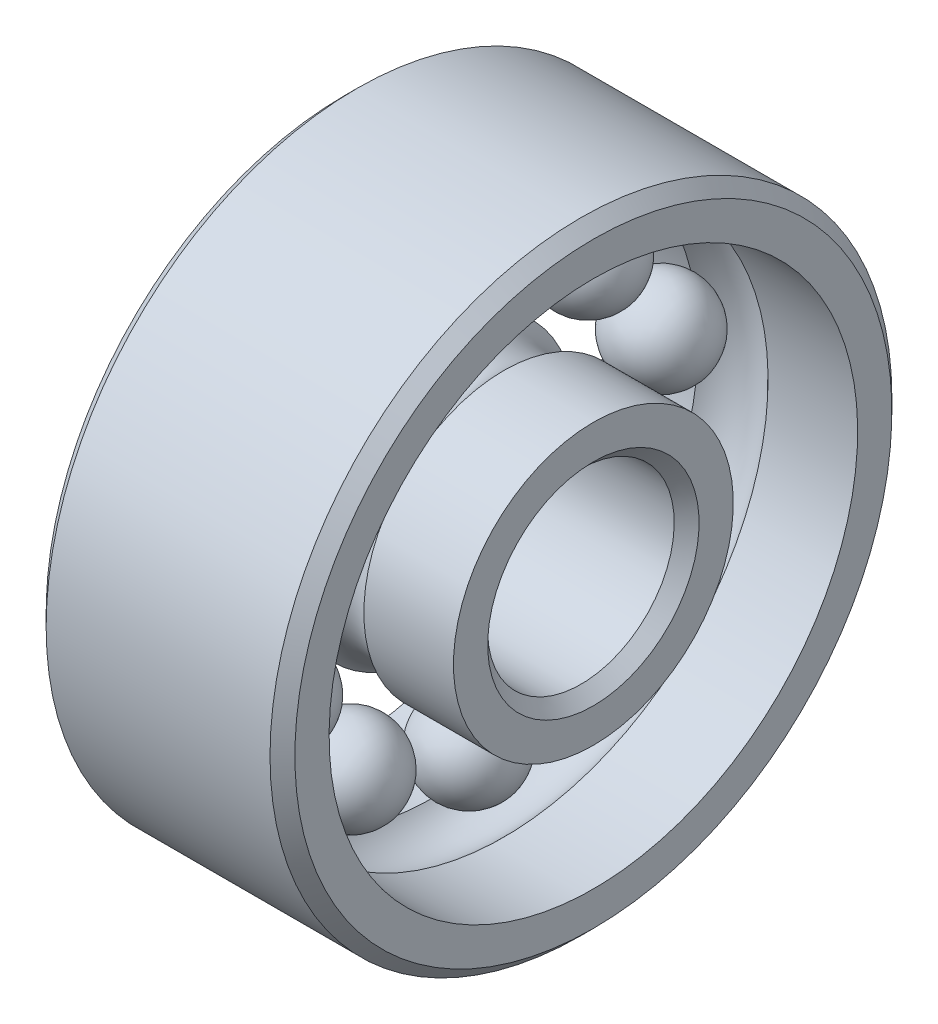
ISO-10303-21;
HEADER;
FILE_DESCRIPTION(('STEP AP214'),'2;1');
FILE_NAME('part.step','',(''),(''),'','','');
FILE_SCHEMA(('AUTOMOTIVE_DESIGN { 1 0 10303 214 1 1 1 1 }'));
ENDSEC;
DATA;
#1=APPLICATION_CONTEXT('core data for automotive mechanical design processes');
#2=APPLICATION_PROTOCOL_DEFINITION('international standard','automotive_design',2000,#1);
#3=PRODUCT_CONTEXT('',#1,'mechanical');
#4=PRODUCT('Part','Part','',(#3));
#5=PRODUCT_RELATED_PRODUCT_CATEGORY('part','',(#4));
#6=PRODUCT_DEFINITION_FORMATION('','',#4);
#7=PRODUCT_DEFINITION_CONTEXT('part definition',#1,'design');
#8=PRODUCT_DEFINITION('design','',#6,#7);
#9=PRODUCT_DEFINITION_SHAPE('','',#8);
#10=(LENGTH_UNIT() NAMED_UNIT(*) SI_UNIT(.MILLI.,.METRE.));
#11=(NAMED_UNIT(*) PLANE_ANGLE_UNIT() SI_UNIT($,.RADIAN.));
#12=(NAMED_UNIT(*) SI_UNIT($,.STERADIAN.) SOLID_ANGLE_UNIT());
#13=UNCERTAINTY_MEASURE_WITH_UNIT(LENGTH_MEASURE(1.E-05),#10,'distance_accuracy_value','');
#14=(GEOMETRIC_REPRESENTATION_CONTEXT(3) GLOBAL_UNCERTAINTY_ASSIGNED_CONTEXT((#13)) GLOBAL_UNIT_ASSIGNED_CONTEXT((#10,
#11,#12)) REPRESENTATION_CONTEXT('',''));
#15=CARTESIAN_POINT('',(0.,0.,0.));
#16=DIRECTION('',(0.,0.,1.));
#17=DIRECTION('',(1.,0.,0.));
#18=AXIS2_PLACEMENT_3D('',#15,#16,#17);
#19=CARTESIAN_POINT('',(0.,2.6293052317186,-1.9103020699505));
#20=DIRECTION('',(-1.,0.,0.));
#21=DIRECTION('',(0.,0.809016994374955,-0.587785252292462));
#22=AXIS2_PLACEMENT_3D('',#19,#20,#21);
#23=SPHERICAL_SURFACE('',#22,0.75);
#24=CARTESIAN_POINT('',(-0.75,2.6293052317186,-1.9103020699505));
#25=VERTEX_POINT('',#24);
#26=VERTEX_LOOP('',#25);
#27=FACE_BOUND('',#26,.T.);
#28=ADVANCED_FACE('F38',(#27),#23,.T.);
#29=CLOSED_SHELL('',(#28));
#30=MANIFOLD_SOLID_BREP('B2',#29);
#31=CARTESIAN_POINT('',(0.,1.00430523171861,-3.09093367795924));
#32=DIRECTION('',(-1.,0.,0.));
#33=DIRECTION('',(0.,0.309016994374958,-0.95105651629515));
#34=AXIS2_PLACEMENT_3D('',#31,#32,#33);
#35=SPHERICAL_SURFACE('',#34,0.75);
#36=CARTESIAN_POINT('',(-0.75,1.00430523171861,-3.09093367795924));
#37=VERTEX_POINT('',#36);
#38=VERTEX_LOOP('',#37);
#39=FACE_BOUND('',#38,.T.);
#40=ADVANCED_FACE('F57',(#39),#35,.T.);
#41=CLOSED_SHELL('',(#40));
#42=MANIFOLD_SOLID_BREP('B6',#41);
#43=CARTESIAN_POINT('',(0.,-1.00430523171855,-3.09093367795926));
#44=DIRECTION('',(-1.,0.,0.));
#45=DIRECTION('',(0.,-0.309016994374938,-0.951056516295157));
#46=AXIS2_PLACEMENT_3D('',#43,#44,#45);
#47=SPHERICAL_SURFACE('',#46,0.75);
#48=CARTESIAN_POINT('',(-0.749999999999999,-1.00430523171855,-3.09093367795926));
#49=VERTEX_POINT('',#48);
#50=VERTEX_LOOP('',#49);
#51=FACE_BOUND('',#50,.T.);
#52=ADVANCED_FACE('F76',(#51),#47,.T.);
#53=CLOSED_SHELL('',(#52));
#54=MANIFOLD_SOLID_BREP('B34',#53);
#55=CARTESIAN_POINT('',(0.,-2.62930523171856,-1.91030206995056));
#56=DIRECTION('',(-1.,0.,0.));
#57=DIRECTION('',(0.,-0.809016994374942,-0.58778525229248));
#58=AXIS2_PLACEMENT_3D('',#55,#56,#57);
#59=SPHERICAL_SURFACE('',#58,0.75);
#60=CARTESIAN_POINT('',(-0.749999999999999,-2.62930523171856,-1.91030206995056));
#61=VERTEX_POINT('',#60);
#62=VERTEX_LOOP('',#61);
#63=FACE_BOUND('',#62,.T.);
#64=ADVANCED_FACE('F95',(#63),#59,.T.);
#65=CLOSED_SHELL('',(#64));
#66=MANIFOLD_SOLID_BREP('B53',#65);
#67=CARTESIAN_POINT('',(0.,-3.25,0.));
#68=DIRECTION('',(-1.,0.,0.));
#69=DIRECTION('',(0.,-1.,0.));
#70=AXIS2_PLACEMENT_3D('',#67,#68,#69);
#71=SPHERICAL_SURFACE('',#70,0.75);
#72=CARTESIAN_POINT('',(-0.749999999999999,-3.25,0.));
#73=VERTEX_POINT('',#72);
#74=VERTEX_LOOP('',#73);
#75=FACE_BOUND('',#74,.T.);
#76=ADVANCED_FACE('F114',(#75),#71,.T.);
#77=CLOSED_SHELL('',(#76));
#78=MANIFOLD_SOLID_BREP('B72',#77);
#79=CARTESIAN_POINT('',(0.,-2.62930523171859,1.91030206995052));
#80=DIRECTION('',(-1.,0.,0.));
#81=DIRECTION('',(0.,-0.809016994374951,0.587785252292469));
#82=AXIS2_PLACEMENT_3D('',#79,#80,#81);
#83=SPHERICAL_SURFACE('',#82,0.75);
#84=CARTESIAN_POINT('',(-0.749999999999999,-2.62930523171859,1.91030206995052));
#85=VERTEX_POINT('',#84);
#86=VERTEX_LOOP('',#85);
#87=FACE_BOUND('',#86,.T.);
#88=ADVANCED_FACE('F133',(#87),#83,.T.);
#89=CLOSED_SHELL('',(#88));
#90=MANIFOLD_SOLID_BREP('B91',#89);
#91=CARTESIAN_POINT('',(0.,-1.00430523171859,3.09093367795925));
#92=DIRECTION('',(-1.,0.,0.));
#93=DIRECTION('',(0.,-0.309016994374952,0.951056516295152));
#94=AXIS2_PLACEMENT_3D('',#91,#92,#93);
#95=SPHERICAL_SURFACE('',#94,0.75);
#96=CARTESIAN_POINT('',(-0.749999999999999,-1.00430523171859,3.09093367795925));
#97=VERTEX_POINT('',#96);
#98=VERTEX_LOOP('',#97);
#99=FACE_BOUND('',#98,.T.);
#100=ADVANCED_FACE('F152',(#99),#95,.T.);
#101=CLOSED_SHELL('',(#100));
#102=MANIFOLD_SOLID_BREP('B110',#101);
#103=CARTESIAN_POINT('',(0.,1.00430523171857,3.09093367795925));
#104=DIRECTION('',(-1.,0.,0.));
#105=DIRECTION('',(0.,0.309016994374945,0.951056516295155));
#106=AXIS2_PLACEMENT_3D('',#103,#104,#105);
#107=SPHERICAL_SURFACE('',#106,0.75);
#108=CARTESIAN_POINT('',(-0.75,1.00430523171857,3.09093367795925));
#109=VERTEX_POINT('',#108);
#110=VERTEX_LOOP('',#109);
#111=FACE_BOUND('',#110,.T.);
#112=ADVANCED_FACE('F171',(#111),#107,.T.);
#113=CLOSED_SHELL('',(#112));
#114=MANIFOLD_SOLID_BREP('B129',#113);
#115=CARTESIAN_POINT('',(0.,2.62930523171858,1.91030206995054));
#116=DIRECTION('',(-1.,0.,0.));
#117=DIRECTION('',(0.,0.809016994374947,0.587785252292474));
#118=AXIS2_PLACEMENT_3D('',#115,#116,#117);
#119=SPHERICAL_SURFACE('',#118,0.75);
#120=CARTESIAN_POINT('',(-0.75,2.62930523171858,1.91030206995054));
#121=VERTEX_POINT('',#120);
#122=VERTEX_LOOP('',#121);
#123=FACE_BOUND('',#122,.T.);
#124=ADVANCED_FACE('F190',(#123),#119,.T.);
#125=CLOSED_SHELL('',(#124));
#126=MANIFOLD_SOLID_BREP('B148',#125);
#127=CARTESIAN_POINT('',(0.,3.25,0.));
#128=DIRECTION('',(-1.,0.,0.));
#129=DIRECTION('',(0.,1.,0.));
#130=AXIS2_PLACEMENT_3D('',#127,#128,#129);
#131=SPHERICAL_SURFACE('',#130,0.75);
#132=CARTESIAN_POINT('',(-0.75,3.25,0.));
#133=VERTEX_POINT('',#132);
#134=VERTEX_LOOP('',#133);
#135=FACE_BOUND('',#134,.T.);
#136=ADVANCED_FACE('F211',(#135),#131,.T.);
#137=CLOSED_SHELL('',(#136));
#138=MANIFOLD_SOLID_BREP('B167',#137);
#139=CARTESIAN_POINT('',(2.,5.,0.));
#140=DIRECTION('',(1.,0.,0.));
#141=DIRECTION('',(0.,1.,0.));
#142=AXIS2_PLACEMENT_3D('',#139,#140,#141);
#143=PLANE('',#142);
#144=CARTESIAN_POINT('',(2.,0.,0.));
#145=DIRECTION('',(1.,0.,0.));
#146=DIRECTION('',(0.,1.,0.));
#147=AXIS2_PLACEMENT_3D('',#144,#145,#146);
#148=CIRCLE('',#147,4.80000000000001);
#149=CARTESIAN_POINT('',(2.,4.80000000000001,0.));
#150=VERTEX_POINT('',#149);
#151=EDGE_CURVE('E210',#150,#150,#148,.T.);
#152=ORIENTED_EDGE('',*,*,#151,.T.);
#153=EDGE_LOOP('',(#152));
#154=FACE_BOUND('',#153,.T.);
#155=CARTESIAN_POINT('',(2.,0.,0.));
#156=DIRECTION('',(1.,0.,0.));
#157=DIRECTION('',(0.,1.,0.));
#158=AXIS2_PLACEMENT_3D('',#155,#156,#157);
#159=CIRCLE('',#158,4.25);
#160=CARTESIAN_POINT('',(2.,4.25,0.));
#161=VERTEX_POINT('',#160);
#162=EDGE_CURVE('E252',#161,#161,#159,.T.);
#163=ORIENTED_EDGE('',*,*,#162,.F.);
#164=EDGE_LOOP('',(#163));
#165=FACE_BOUND('',#164,.T.);
#166=ADVANCED_FACE('F231',(#154,#165),#143,.T.);
#167=CARTESIAN_POINT('',(1.05892746709144,0.,0.));
#168=DIRECTION('',(1.,0.,0.));
#169=DIRECTION('',(0.,1.,0.));
#170=AXIS2_PLACEMENT_3D('',#167,#168,#169);
#171=CYLINDRICAL_SURFACE('',#170,4.25);
#172=ORIENTED_EDGE('',*,*,#162,.T.);
#173=EDGE_LOOP('',(#172));
#174=FACE_BOUND('',#173,.T.);
#175=CARTESIAN_POINT('',(0.559016994374949,0.,0.));
#176=DIRECTION('',(1.,0.,0.));
#177=DIRECTION('',(0.,1.,0.));
#178=AXIS2_PLACEMENT_3D('',#175,#176,#177);
#179=CIRCLE('',#178,4.25);
#180=CARTESIAN_POINT('',(0.559016994374948,4.25,0.));
#181=VERTEX_POINT('',#180);
#182=EDGE_CURVE('E255',#181,#181,#179,.T.);
#183=ORIENTED_EDGE('',*,*,#182,.F.);
#184=EDGE_LOOP('',(#183));
#185=FACE_BOUND('',#184,.T.);
#186=ADVANCED_FACE('F278',(#174,#185),#171,.F.);
#187=CARTESIAN_POINT('',(0.,0.,0.));
#188=DIRECTION('',(1.,0.,0.));
#189=DIRECTION('',(0.,1.,0.));
#190=AXIS2_PLACEMENT_3D('',#187,#188,#189);
#191=TOROIDAL_SURFACE('',#190,3.75,0.75);
#192=ORIENTED_EDGE('',*,*,#182,.T.);
#193=EDGE_LOOP('',(#192));
#194=FACE_BOUND('',#193,.T.);
#195=CARTESIAN_POINT('',(-0.559016994374948,0.,0.));
#196=DIRECTION('',(1.,0.,0.));
#197=DIRECTION('',(0.,1.,0.));
#198=AXIS2_PLACEMENT_3D('',#195,#196,#197);
#199=CIRCLE('',#198,4.25);
#200=CARTESIAN_POINT('',(-0.559016994374948,4.25,0.));
#201=VERTEX_POINT('',#200);
#202=EDGE_CURVE('E258',#201,#201,#199,.T.);
#203=ORIENTED_EDGE('',*,*,#202,.F.);
#204=EDGE_LOOP('',(#203));
#205=FACE_BOUND('',#204,.T.);
#206=ADVANCED_FACE('F269',(#194,#205),#191,.F.);
#207=CARTESIAN_POINT('',(1.05892746709144,0.,0.));
#208=DIRECTION('',(1.,0.,0.));
#209=DIRECTION('',(0.,1.,0.));
#210=AXIS2_PLACEMENT_3D('',#207,#208,#209);
#211=CYLINDRICAL_SURFACE('',#210,4.25);
#212=ORIENTED_EDGE('',*,*,#202,.T.);
#213=EDGE_LOOP('',(#212));
#214=FACE_BOUND('',#213,.T.);
#215=CARTESIAN_POINT('',(-2.,0.,0.));
#216=DIRECTION('',(1.,0.,0.));
#217=DIRECTION('',(0.,1.,0.));
#218=AXIS2_PLACEMENT_3D('',#215,#216,#217);
#219=CIRCLE('',#218,4.25);
#220=CARTESIAN_POINT('',(-2.,4.25,0.));
#221=VERTEX_POINT('',#220);
#222=EDGE_CURVE('E261',#221,#221,#219,.T.);
#223=ORIENTED_EDGE('',*,*,#222,.F.);
#224=EDGE_LOOP('',(#223));
#225=FACE_BOUND('',#224,.T.);
#226=ADVANCED_FACE('F267',(#214,#225),#211,.F.);
#227=CARTESIAN_POINT('',(-2.,4.25,0.));
#228=DIRECTION('',(-1.,0.,0.));
#229=DIRECTION('',(0.,-1.,0.));
#230=AXIS2_PLACEMENT_3D('',#227,#228,#229);
#231=PLANE('',#230);
#232=CARTESIAN_POINT('',(-2.,0.,0.));
#233=DIRECTION('',(-1.,0.,0.));
#234=DIRECTION('',(0.,-1.,0.));
#235=AXIS2_PLACEMENT_3D('',#232,#233,#234);
#236=CIRCLE('',#235,4.8);
#237=CARTESIAN_POINT('',(-2.,-4.8,0.));
#238=VERTEX_POINT('',#237);
#239=EDGE_CURVE('E239',#238,#238,#236,.T.);
#240=ORIENTED_EDGE('',*,*,#239,.T.);
#241=EDGE_LOOP('',(#240));
#242=FACE_BOUND('',#241,.T.);
#243=ORIENTED_EDGE('',*,*,#222,.T.);
#244=EDGE_LOOP('',(#243));
#245=FACE_BOUND('',#244,.T.);
#246=ADVANCED_FACE('F265',(#242,#245),#231,.T.);
#247=CARTESIAN_POINT('',(1.05892746709144,0.,0.));
#248=DIRECTION('',(1.,0.,0.));
#249=DIRECTION('',(0.,1.,0.));
#250=AXIS2_PLACEMENT_3D('',#247,#248,#249);
#251=CYLINDRICAL_SURFACE('',#250,5.);
#252=CARTESIAN_POINT('',(-1.8,0.,0.));
#253=DIRECTION('',(-1.,0.,0.));
#254=DIRECTION('',(0.,-1.,0.));
#255=AXIS2_PLACEMENT_3D('',#252,#253,#254);
#256=CIRCLE('',#255,5.);
#257=CARTESIAN_POINT('',(-1.8,-5.,0.));
#258=VERTEX_POINT('',#257);
#259=EDGE_CURVE('E243',#258,#258,#256,.F.);
#260=ORIENTED_EDGE('',*,*,#259,.T.);
#261=EDGE_LOOP('',(#260));
#262=FACE_BOUND('',#261,.T.);
#263=CARTESIAN_POINT('',(1.8,0.,0.));
#264=DIRECTION('',(1.,0.,0.));
#265=DIRECTION('',(0.,1.,0.));
#266=AXIS2_PLACEMENT_3D('',#263,#264,#265);
#267=CIRCLE('',#266,5.);
#268=CARTESIAN_POINT('',(1.8,5.,0.));
#269=VERTEX_POINT('',#268);
#270=EDGE_CURVE('E247',#269,#269,#267,.F.);
#271=ORIENTED_EDGE('',*,*,#270,.T.);
#272=EDGE_LOOP('',(#271));
#273=FACE_BOUND('',#272,.T.);
#274=ADVANCED_FACE('F276',(#262,#273),#251,.T.);
#275=CARTESIAN_POINT('',(-1.8,0.,0.));
#276=DIRECTION('',(1.,0.,0.));
#277=DIRECTION('',(0.,1.,0.));
#278=AXIS2_PLACEMENT_3D('',#275,#276,#277);
#279=CONICAL_SURFACE('',#278,5.,0.78539816339745);
#280=ORIENTED_EDGE('',*,*,#239,.F.);
#281=EDGE_LOOP('',(#280));
#282=FACE_BOUND('',#281,.T.);
#283=ORIENTED_EDGE('',*,*,#259,.F.);
#284=EDGE_LOOP('',(#283));
#285=FACE_BOUND('',#284,.T.);
#286=ADVANCED_FACE('F290',(#282,#285),#279,.T.);
#287=CARTESIAN_POINT('',(2.,0.,0.));
#288=DIRECTION('',(-1.,0.,0.));
#289=DIRECTION('',(0.,-1.,0.));
#290=AXIS2_PLACEMENT_3D('',#287,#288,#289);
#291=CONICAL_SURFACE('',#290,4.80000000000001,0.785398163397441);
#292=ORIENTED_EDGE('',*,*,#270,.F.);
#293=EDGE_LOOP('',(#292));
#294=FACE_BOUND('',#293,.T.);
#295=ORIENTED_EDGE('',*,*,#151,.F.);
#296=EDGE_LOOP('',(#295));
#297=FACE_BOUND('',#296,.T.);
#298=ADVANCED_FACE('F234',(#294,#297),#291,.T.);
#299=CLOSED_SHELL('',(#166,#186,#206,#226,#246,#274,#286,#298));
#300=MANIFOLD_SOLID_BREP('B186',#299);
#301=CARTESIAN_POINT('',(1.05892746709144,0.,0.));
#302=DIRECTION('',(1.,0.,0.));
#303=DIRECTION('',(0.,1.,0.));
#304=AXIS2_PLACEMENT_3D('',#301,#302,#303);
#305=CYLINDRICAL_SURFACE('',#304,2.25);
#306=CARTESIAN_POINT('',(0.559016994374947,0.,0.));
#307=DIRECTION('',(1.,0.,0.));
#308=DIRECTION('',(0.,1.,0.));
#309=AXIS2_PLACEMENT_3D('',#306,#307,#308);
#310=CIRCLE('',#309,2.25);
#311=CARTESIAN_POINT('',(0.559016994374947,2.25,0.));
#312=VERTEX_POINT('',#311);
#313=EDGE_CURVE('E380',#312,#312,#310,.T.);
#314=ORIENTED_EDGE('',*,*,#313,.T.);
#315=EDGE_LOOP('',(#314));
#316=FACE_BOUND('',#315,.T.);
#317=CARTESIAN_POINT('',(2.,0.,0.));
#318=DIRECTION('',(1.,0.,0.));
#319=DIRECTION('',(0.,1.,0.));
#320=AXIS2_PLACEMENT_3D('',#317,#318,#319);
#321=CIRCLE('',#320,2.25);
#322=CARTESIAN_POINT('',(2.,2.25,0.));
#323=VERTEX_POINT('',#322);
#324=EDGE_CURVE('E389',#323,#323,#321,.T.);
#325=ORIENTED_EDGE('',*,*,#324,.F.);
#326=EDGE_LOOP('',(#325));
#327=FACE_BOUND('',#326,.T.);
#328=ADVANCED_FACE('F359',(#316,#327),#305,.T.);
#329=CARTESIAN_POINT('',(0.,0.,0.));
#330=DIRECTION('',(1.,0.,0.));
#331=DIRECTION('',(0.,1.,0.));
#332=AXIS2_PLACEMENT_3D('',#329,#330,#331);
#333=TOROIDAL_SURFACE('',#332,2.75,0.75);
#334=CARTESIAN_POINT('',(-0.559016994374947,0.,0.));
#335=DIRECTION('',(1.,0.,0.));
#336=DIRECTION('',(0.,1.,0.));
#337=AXIS2_PLACEMENT_3D('',#334,#335,#336);
#338=CIRCLE('',#337,2.25);
#339=CARTESIAN_POINT('',(-0.559016994374948,2.25,0.));
#340=VERTEX_POINT('',#339);
#341=EDGE_CURVE('E383',#340,#340,#338,.T.);
#342=ORIENTED_EDGE('',*,*,#341,.T.);
#343=EDGE_LOOP('',(#342));
#344=FACE_BOUND('',#343,.T.);
#345=ORIENTED_EDGE('',*,*,#313,.F.);
#346=EDGE_LOOP('',(#345));
#347=FACE_BOUND('',#346,.T.);
#348=ADVANCED_FACE('F396',(#344,#347),#333,.F.);
#349=CARTESIAN_POINT('',(1.05892746709144,0.,0.));
#350=DIRECTION('',(1.,0.,0.));
#351=DIRECTION('',(0.,1.,0.));
#352=AXIS2_PLACEMENT_3D('',#349,#350,#351);
#353=CYLINDRICAL_SURFACE('',#352,2.25);
#354=CARTESIAN_POINT('',(-2.,0.,0.));
#355=DIRECTION('',(1.,0.,0.));
#356=DIRECTION('',(0.,1.,0.));
#357=AXIS2_PLACEMENT_3D('',#354,#355,#356);
#358=CIRCLE('',#357,2.25);
#359=CARTESIAN_POINT('',(-2.,2.25,0.));
#360=VERTEX_POINT('',#359);
#361=EDGE_CURVE('E386',#360,#360,#358,.T.);
#362=ORIENTED_EDGE('',*,*,#361,.T.);
#363=EDGE_LOOP('',(#362));
#364=FACE_BOUND('',#363,.T.);
#365=ORIENTED_EDGE('',*,*,#341,.F.);
#366=EDGE_LOOP('',(#365));
#367=FACE_BOUND('',#366,.T.);
#368=ADVANCED_FACE('F402',(#364,#367),#353,.T.);
#369=CARTESIAN_POINT('',(-2.,1.5,0.));
#370=DIRECTION('',(-1.,0.,0.));
#371=DIRECTION('',(0.,-1.,0.));
#372=AXIS2_PLACEMENT_3D('',#369,#370,#371);
#373=PLANE('',#372);
#374=CARTESIAN_POINT('',(-2.,0.,0.));
#375=DIRECTION('',(-1.,0.,0.));
#376=DIRECTION('',(0.,-1.,0.));
#377=AXIS2_PLACEMENT_3D('',#374,#375,#376);
#378=CIRCLE('',#377,1.7);
#379=CARTESIAN_POINT('',(-2.,-1.7,0.));
#380=VERTEX_POINT('',#379);
#381=EDGE_CURVE('E230',#380,#380,#378,.F.);
#382=ORIENTED_EDGE('',*,*,#381,.T.);
#383=EDGE_LOOP('',(#382));
#384=FACE_BOUND('',#383,.T.);
#385=ORIENTED_EDGE('',*,*,#361,.F.);
#386=EDGE_LOOP('',(#385));
#387=FACE_BOUND('',#386,.T.);
#388=ADVANCED_FACE('F424',(#384,#387),#373,.T.);
#389=CARTESIAN_POINT('',(1.05892746709144,0.,0.));
#390=DIRECTION('',(1.,0.,0.));
#391=DIRECTION('',(0.,1.,0.));
#392=AXIS2_PLACEMENT_3D('',#389,#390,#391);
#393=CYLINDRICAL_SURFACE('',#392,1.5);
#394=CARTESIAN_POINT('',(1.8,0.,0.));
#395=DIRECTION('',(1.,0.,0.));
#396=DIRECTION('',(0.,1.,0.));
#397=AXIS2_PLACEMENT_3D('',#394,#395,#396);
#398=CIRCLE('',#397,1.5);
#399=CARTESIAN_POINT('',(1.8,1.5,0.));
#400=VERTEX_POINT('',#399);
#401=EDGE_CURVE('E371',#400,#400,#398,.T.);
#402=ORIENTED_EDGE('',*,*,#401,.T.);
#403=EDGE_LOOP('',(#402));
#404=FACE_BOUND('',#403,.T.);
#405=CARTESIAN_POINT('',(-1.8,0.,0.));
#406=DIRECTION('',(-1.,0.,0.));
#407=DIRECTION('',(0.,-1.,0.));
#408=AXIS2_PLACEMENT_3D('',#405,#406,#407);
#409=CIRCLE('',#408,1.5);
#410=CARTESIAN_POINT('',(-1.8,-1.5,0.));
#411=VERTEX_POINT('',#410);
#412=EDGE_CURVE('E375',#411,#411,#409,.T.);
#413=ORIENTED_EDGE('',*,*,#412,.T.);
#414=EDGE_LOOP('',(#413));
#415=FACE_BOUND('',#414,.T.);
#416=ADVANCED_FACE('F417',(#404,#415),#393,.F.);
#417=CARTESIAN_POINT('',(2.,1.5,0.));
#418=DIRECTION('',(1.,0.,0.));
#419=DIRECTION('',(0.,1.,0.));
#420=AXIS2_PLACEMENT_3D('',#417,#418,#419);
#421=PLANE('',#420);
#422=CARTESIAN_POINT('',(2.,0.,0.));
#423=DIRECTION('',(1.,0.,0.));
#424=DIRECTION('',(0.,1.,0.));
#425=AXIS2_PLACEMENT_3D('',#422,#423,#424);
#426=CIRCLE('',#425,1.7);
#427=CARTESIAN_POINT('',(2.,1.7,0.));
#428=VERTEX_POINT('',#427);
#429=EDGE_CURVE('E367',#428,#428,#426,.F.);
#430=ORIENTED_EDGE('',*,*,#429,.T.);
#431=EDGE_LOOP('',(#430));
#432=FACE_BOUND('',#431,.T.);
#433=ORIENTED_EDGE('',*,*,#324,.T.);
#434=EDGE_LOOP('',(#433));
#435=FACE_BOUND('',#434,.T.);
#436=ADVANCED_FACE('F393',(#432,#435),#421,.T.);
#437=CARTESIAN_POINT('',(1.8,0.,0.));
#438=DIRECTION('',(1.,0.,0.));
#439=DIRECTION('',(0.,1.,0.));
#440=AXIS2_PLACEMENT_3D('',#437,#438,#439);
#441=CONICAL_SURFACE('',#440,1.5,0.785398163397451);
#442=ORIENTED_EDGE('',*,*,#429,.F.);
#443=EDGE_LOOP('',(#442));
#444=FACE_BOUND('',#443,.T.);
#445=ORIENTED_EDGE('',*,*,#401,.F.);
#446=EDGE_LOOP('',(#445));
#447=FACE_BOUND('',#446,.T.);
#448=ADVANCED_FACE('F407',(#444,#447),#441,.F.);
#449=CARTESIAN_POINT('',(-2.,0.,0.));
#450=DIRECTION('',(-1.,0.,0.));
#451=DIRECTION('',(0.,-1.,0.));
#452=AXIS2_PLACEMENT_3D('',#449,#450,#451);
#453=CONICAL_SURFACE('',#452,1.7,0.785398163397447);
#454=CARTESIAN_POINT('',(-1.8,-1.5,0.));
#455=CARTESIAN_POINT('',(-1.80208333333333,-1.50208333333333,0.));
#456=CARTESIAN_POINT('',(-1.80416666666667,-1.50416666666667,0.));
#457=CARTESIAN_POINT('',(-1.80833333333333,-1.50833333333333,0.));
#458=CARTESIAN_POINT('',(-1.81041666666667,-1.51041666666667,0.));
#459=CARTESIAN_POINT('',(-1.81458333333333,-1.51458333333333,0.));
#460=CARTESIAN_POINT('',(-1.81666666666667,-1.51666666666667,0.));
#461=CARTESIAN_POINT('',(-1.82083333333333,-1.52083333333333,0.));
#462=CARTESIAN_POINT('',(-1.82291666666667,-1.52291666666667,0.));
#463=CARTESIAN_POINT('',(-1.82708333333333,-1.52708333333333,0.));
#464=CARTESIAN_POINT('',(-1.82916666666667,-1.52916666666667,0.));
#465=CARTESIAN_POINT('',(-1.83333333333333,-1.53333333333333,0.));
#466=CARTESIAN_POINT('',(-1.83541666666667,-1.53541666666667,0.));
#467=CARTESIAN_POINT('',(-1.83958333333333,-1.53958333333333,0.));
#468=CARTESIAN_POINT('',(-1.84166666666667,-1.54166666666667,0.));
#469=CARTESIAN_POINT('',(-1.84583333333333,-1.54583333333333,0.));
#470=CARTESIAN_POINT('',(-1.84791666666667,-1.54791666666667,0.));
#471=CARTESIAN_POINT('',(-1.85208333333333,-1.55208333333333,0.));
#472=CARTESIAN_POINT('',(-1.85416666666667,-1.55416666666667,0.));
#473=CARTESIAN_POINT('',(-1.85833333333333,-1.55833333333333,0.));
#474=CARTESIAN_POINT('',(-1.86041666666667,-1.56041666666667,0.));
#475=CARTESIAN_POINT('',(-1.86458333333333,-1.56458333333333,0.));
#476=CARTESIAN_POINT('',(-1.86666666666667,-1.56666666666667,0.));
#477=CARTESIAN_POINT('',(-1.87083333333333,-1.57083333333333,0.));
#478=CARTESIAN_POINT('',(-1.87291666666667,-1.57291666666667,0.));
#479=CARTESIAN_POINT('',(-1.87708333333333,-1.57708333333333,0.));
#480=CARTESIAN_POINT('',(-1.87916666666667,-1.57916666666667,0.));
#481=CARTESIAN_POINT('',(-1.88333333333333,-1.58333333333333,0.));
#482=CARTESIAN_POINT('',(-1.88541666666667,-1.58541666666667,0.));
#483=CARTESIAN_POINT('',(-1.88958333333333,-1.58958333333333,0.));
#484=CARTESIAN_POINT('',(-1.89166666666667,-1.59166666666667,0.));
#485=CARTESIAN_POINT('',(-1.89583333333333,-1.59583333333333,0.));
#486=CARTESIAN_POINT('',(-1.89791666666667,-1.59791666666667,0.));
#487=CARTESIAN_POINT('',(-1.90208333333333,-1.60208333333333,0.));
#488=CARTESIAN_POINT('',(-1.90416666666667,-1.60416666666667,0.));
#489=CARTESIAN_POINT('',(-1.90833333333333,-1.60833333333333,0.));
#490=CARTESIAN_POINT('',(-1.91041666666667,-1.61041666666667,0.));
#491=CARTESIAN_POINT('',(-1.91458333333333,-1.61458333333333,0.));
#492=CARTESIAN_POINT('',(-1.91666666666667,-1.61666666666667,0.));
#493=CARTESIAN_POINT('',(-1.92083333333333,-1.62083333333333,0.));
#494=CARTESIAN_POINT('',(-1.92291666666667,-1.62291666666667,0.));
#495=CARTESIAN_POINT('',(-1.92708333333333,-1.62708333333333,0.));
#496=CARTESIAN_POINT('',(-1.92916666666667,-1.62916666666667,0.));
#497=CARTESIAN_POINT('',(-1.93333333333333,-1.63333333333333,0.));
#498=CARTESIAN_POINT('',(-1.93541666666667,-1.63541666666667,0.));
#499=CARTESIAN_POINT('',(-1.93958333333333,-1.63958333333333,0.));
#500=CARTESIAN_POINT('',(-1.94166666666667,-1.64166666666667,0.));
#501=CARTESIAN_POINT('',(-1.94583333333333,-1.64583333333333,0.));
#502=CARTESIAN_POINT('',(-1.94791666666667,-1.64791666666667,0.));
#503=CARTESIAN_POINT('',(-1.95208333333333,-1.65208333333333,0.));
#504=CARTESIAN_POINT('',(-1.95416666666667,-1.65416666666667,0.));
#505=CARTESIAN_POINT('',(-1.95833333333333,-1.65833333333333,0.));
#506=CARTESIAN_POINT('',(-1.96041666666667,-1.66041666666667,0.));
#507=CARTESIAN_POINT('',(-1.96458333333333,-1.66458333333333,0.));
#508=CARTESIAN_POINT('',(-1.96666666666667,-1.66666666666667,0.));
#509=CARTESIAN_POINT('',(-1.97083333333333,-1.67083333333333,0.));
#510=CARTESIAN_POINT('',(-1.97291666666667,-1.67291666666667,0.));
#511=CARTESIAN_POINT('',(-1.97708333333333,-1.67708333333333,0.));
#512=CARTESIAN_POINT('',(-1.97916666666667,-1.67916666666667,0.));
#513=CARTESIAN_POINT('',(-1.98333333333333,-1.68333333333333,0.));
#514=CARTESIAN_POINT('',(-1.98541666666667,-1.68541666666667,0.));
#515=CARTESIAN_POINT('',(-1.98958333333333,-1.68958333333333,0.));
#516=CARTESIAN_POINT('',(-1.99166666666667,-1.69166666666667,0.));
#517=CARTESIAN_POINT('',(-1.99583333333333,-1.69583333333333,0.));
#518=CARTESIAN_POINT('',(-1.99791666666667,-1.69791666666667,0.));
#519=CARTESIAN_POINT('',(-2.,-1.7,0.));
#520=B_SPLINE_CURVE_WITH_KNOTS('',3,(#454,#455,#456,#457,#458,#459,#460,#461,#462,#463,#464,
#465,#466,#467,#468,#469,#470,#471,#472,#473,#474,#475,#476,#477,#478,#479,#480,#481,#482,#483,
#484,#485,#486,#487,#488,#489,#490,#491,#492,#493,#494,#495,#496,#497,#498,#499,#500,#501,#502,
#503,#504,#505,#506,#507,#508,#509,#510,#511,#512,#513,#514,#515,#516,#517,#518,#519),
.UNSPECIFIED.,.F.,.F.,(4,2,2,2,2,2,2,2,2,2,2,2,2,2,2,2,2,2,2,2,2,2,2,2,2,2,2,2,2,2,2,2,4),(0.,
0.00883883476483179,0.0176776695296637,0.0265165042944955,0.0353553390593273,0.0441941738241591,
0.0530330085889909,0.0618718433538227,0.0707106781186545,0.0795495128834863,0.0883883476483184,
0.09722718241315,0.106066017177982,0.114904851942814,0.123743686707646,0.132582521472477,
0.141421356237309,0.150260191002141,0.159099025766973,0.167937860531805,0.176776695296636,
0.185615530061468,0.1944543648263,0.203293199591132,0.212132034355964,0.220970869120796,
0.229809703885627,0.238648538650459,0.247487373415291,0.256326208180123,0.265165042944954,
0.274003877709786,0.282842712474618),.UNSPECIFIED.);
#521=EDGE_CURVE('BSEAM362',#411,#380,#520,.T.);
#522=ORIENTED_EDGE('',*,*,#412,.F.);
#523=ORIENTED_EDGE('',*,*,#381,.F.);
#524=ORIENTED_EDGE('',*,*,#521,.T.);
#525=ORIENTED_EDGE('',*,*,#521,.F.);
#526=EDGE_LOOP('',(#522,#524,#523,#525));
#527=FACE_BOUND('',#526,.T.);
#528=ADVANCED_FACE('F362',(#527),#453,.F.);
#529=CLOSED_SHELL('',(#328,#348,#368,#388,#416,#436,#448,#528));
#530=MANIFOLD_SOLID_BREP('B205',#529);
#531=ADVANCED_BREP_SHAPE_REPRESENTATION('',(#18,#30,#42,#54,#66,#78,#90,#102,#114,#126,#138,
#300,#530),#14);
#532=SHAPE_DEFINITION_REPRESENTATION(#9,#531);
ENDSEC;
END-ISO-10303-21;
